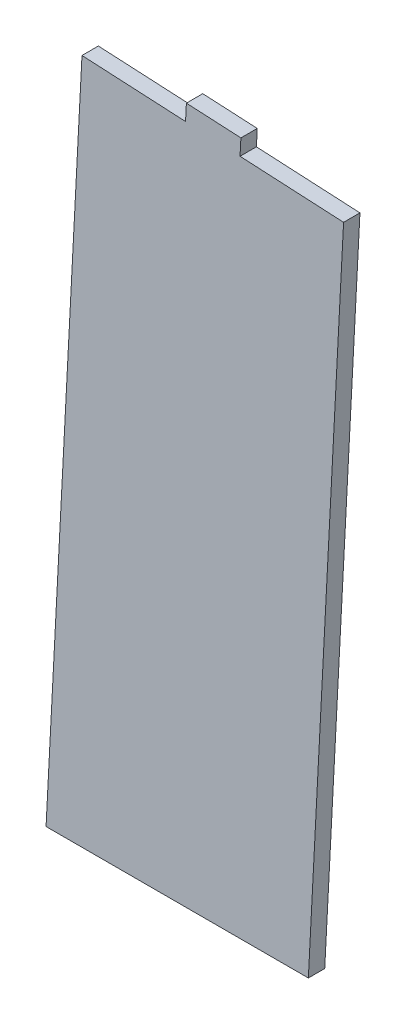
ISO-10303-21;
HEADER;
FILE_DESCRIPTION(('STEP AP214'),'2;1');
FILE_NAME('part.step','',(''),(''),'','','');
FILE_SCHEMA(('AUTOMOTIVE_DESIGN { 1 0 10303 214 1 1 1 1 }'));
ENDSEC;
DATA;
#1=APPLICATION_CONTEXT('core data for automotive mechanical design processes');
#2=APPLICATION_PROTOCOL_DEFINITION('international standard','automotive_design',2000,#1);
#3=PRODUCT_CONTEXT('',#1,'mechanical');
#4=PRODUCT('Part','Part','',(#3));
#5=PRODUCT_RELATED_PRODUCT_CATEGORY('part','',(#4));
#6=PRODUCT_DEFINITION_FORMATION('','',#4);
#7=PRODUCT_DEFINITION_CONTEXT('part definition',#1,'design');
#8=PRODUCT_DEFINITION('design','',#6,#7);
#9=PRODUCT_DEFINITION_SHAPE('','',#8);
#10=(LENGTH_UNIT() NAMED_UNIT(*) SI_UNIT(.MILLI.,.METRE.));
#11=(NAMED_UNIT(*) PLANE_ANGLE_UNIT() SI_UNIT($,.RADIAN.));
#12=(NAMED_UNIT(*) SI_UNIT($,.STERADIAN.) SOLID_ANGLE_UNIT());
#13=UNCERTAINTY_MEASURE_WITH_UNIT(LENGTH_MEASURE(1.E-05),#10,'distance_accuracy_value','');
#14=(GEOMETRIC_REPRESENTATION_CONTEXT(3) GLOBAL_UNCERTAINTY_ASSIGNED_CONTEXT((#13)) GLOBAL_UNIT_ASSIGNED_CONTEXT((#10,
#11,#12)) REPRESENTATION_CONTEXT('',''));
#15=CARTESIAN_POINT('',(0.,0.,0.));
#16=DIRECTION('',(0.,0.,1.));
#17=DIRECTION('',(1.,0.,0.));
#18=AXIS2_PLACEMENT_3D('',#15,#16,#17);
#19=CARTESIAN_POINT('',(4.13878690933079,59.8654361290315,1798.5));
#20=DIRECTION('',(-0.0523359562429365,-0.998629534754574,0.));
#21=DIRECTION('',(0.998629534754574,-0.0523359562429365,0.));
#22=AXIS2_PLACEMENT_3D('',#19,#20,#21);
#23=PLANE('',#22);
#24=DIRECTION('',(0.,0.,-1.));
#25=VECTOR('',#24,1.);
#26=CARTESIAN_POINT('',(18.6189151632721,59.1065647635089,1.5));
#27=LINE('',#26,#25);
#28=CARTESIAN_POINT('',(18.6189151632721,59.1065647635089,1.5));
#29=VERTEX_POINT('',#28);
#30=CARTESIAN_POINT('',(18.6189151632721,59.1065647635089,0.));
#31=VERTEX_POINT('',#30);
#32=EDGE_CURVE('E169',#29,#31,#27,.T.);
#33=ORIENTED_EDGE('',*,*,#32,.F.);
#34=DIRECTION('',(-0.998629534754574,0.0523359562429365,0.));
#35=VECTOR('',#34,1.);
#36=CARTESIAN_POINT('',(3.14015737457621,59.9177720852744,1.50000000000006));
#37=LINE('',#36,#35);
#38=CARTESIAN_POINT('',(28.1058957434406,58.609373179201,1.50000000000006));
#39=VERTEX_POINT('',#38);
#40=EDGE_CURVE('E183',#39,#29,#37,.T.);
#41=ORIENTED_EDGE('',*,*,#40,.F.);
#42=DIRECTION('',(0.,0.,-1.));
#43=VECTOR('',#42,1.);
#44=CARTESIAN_POINT('',(28.1058957434406,58.609373179201,-2.04263689296269E-13));
#45=LINE('',#44,#43);
#46=CARTESIAN_POINT('',(28.1058957434406,58.609373179201,-1.07631097794881E-13));
#47=VERTEX_POINT('',#46);
#48=EDGE_CURVE('E98',#39,#47,#45,.T.);
#49=ORIENTED_EDGE('',*,*,#48,.T.);
#50=DIRECTION('',(-0.998629534754574,0.0523359562429365,0.));
#51=VECTOR('',#50,1.);
#52=CARTESIAN_POINT('',(4.26944748841527,59.8585884982419,0.));
#53=LINE('',#52,#51);
#54=EDGE_CURVE('E189',#47,#31,#53,.T.);
#55=ORIENTED_EDGE('',*,*,#54,.T.);
#56=EDGE_LOOP('',(#33,#41,#49,#55));
#57=FACE_BOUND('',#56,.T.);
#58=ADVANCED_FACE('F42',(#57),#23,.F.);
#59=CARTESIAN_POINT('',(13.6257674894992,59.3682445447236,1.5));
#60=VERTEX_POINT('',#59);
#61=CARTESIAN_POINT('',(4.13878690933078,59.8654361290315,1.50000000000003));
#62=VERTEX_POINT('',#61);
#63=EDGE_CURVE('E188',#60,#62,#37,.T.);
#64=ORIENTED_EDGE('',*,*,#63,.F.);
#65=DIRECTION('',(0.,0.,-1.));
#66=VECTOR('',#65,1.);
#67=CARTESIAN_POINT('',(13.6257674894992,59.3682445447236,1.5));
#68=LINE('',#67,#66);
#69=CARTESIAN_POINT('',(13.6257674894992,59.3682445447236,0.));
#70=VERTEX_POINT('',#69);
#71=EDGE_CURVE('E158',#60,#70,#68,.T.);
#72=ORIENTED_EDGE('',*,*,#71,.T.);
#73=CARTESIAN_POINT('',(4.13878690933079,59.8654361290315,0.));
#74=VERTEX_POINT('',#73);
#75=EDGE_CURVE('E168',#70,#74,#53,.T.);
#76=ORIENTED_EDGE('',*,*,#75,.T.);
#77=DIRECTION('',(0.,0.,-1.));
#78=VECTOR('',#77,1.);
#79=CARTESIAN_POINT('',(4.13878690933078,59.8654361290315,1800.));
#80=LINE('',#79,#78);
#81=EDGE_CURVE('E46',#62,#74,#80,.T.);
#82=ORIENTED_EDGE('',*,*,#81,.F.);
#83=EDGE_LOOP('',(#64,#72,#76,#82));
#84=FACE_BOUND('',#83,.T.);
#85=ADVANCED_FACE('F44',(#84),#23,.F.);
#86=CARTESIAN_POINT('',(0.893128940112842,-4.56540722323783,0.));
#87=DIRECTION('',(0.,0.,-1.));
#88=DIRECTION('',(-1.,0.,0.));
#89=AXIS2_PLACEMENT_3D('',#86,#87,#88);
#90=PLANE('',#89);
#91=ORIENTED_EDGE('',*,*,#54,.F.);
#92=DIRECTION('',(0.0523359562429369,0.998629534754574,0.));
#93=VECTOR('',#92,1.);
#94=CARTESIAN_POINT('',(25.0442423032288,0.189545396058448,-2.15262195589763E-13));
#95=LINE('',#94,#93);
#96=CARTESIAN_POINT('',(24.8788982427083,-2.96540722323783,-2.18193638626963E-13));
#97=VERTEX_POINT('',#96);
#98=EDGE_CURVE('E11',#97,#47,#95,.T.);
#99=ORIENTED_EDGE('',*,*,#98,.F.);
#100=DIRECTION('',(1.,0.,0.));
#101=VECTOR('',#100,1.);
#102=CARTESIAN_POINT('',(24.8788982427083,-2.96540722323783,-2.19659360145563E-13));
#103=LINE('',#102,#101);
#104=CARTESIAN_POINT('',(0.845961938758162,-2.96540722323783,-1.47596055747693E-13));
#105=VERTEX_POINT('',#104);
#106=EDGE_CURVE('E70',#105,#97,#103,.T.);
#107=ORIENTED_EDGE('',*,*,#106,.F.);
#108=DIRECTION('',(-0.0523359562429369,-0.998629534754574,0.));
#109=VECTOR('',#108,1.);
#110=CARTESIAN_POINT('',(4.13878690933079,59.8654361290315,0.));
#111=LINE('',#110,#109);
#112=EDGE_CURVE('E51',#74,#105,#111,.T.);
#113=ORIENTED_EDGE('',*,*,#112,.F.);
#114=ORIENTED_EDGE('',*,*,#75,.F.);
#115=DIRECTION('',(0.052335956242937,0.998629534754574,0.));
#116=VECTOR('',#115,1.);
#117=CARTESIAN_POINT('',(13.6257674894992,59.3682445447236,0.));
#118=LINE('',#117,#116);
#119=CARTESIAN_POINT('',(13.7042714238637,60.8661888468555,0.));
#120=VERTEX_POINT('',#119);
#121=EDGE_CURVE('E61',#70,#120,#118,.T.);
#122=ORIENTED_EDGE('',*,*,#121,.T.);
#123=DIRECTION('',(0.998629534754574,-0.0523359562429368,0.));
#124=VECTOR('',#123,1.);
#125=CARTESIAN_POINT('',(13.7042714238637,60.8661888468555,0.));
#126=LINE('',#125,#124);
#127=CARTESIAN_POINT('',(18.6974190976365,60.6045090656408,0.));
#128=VERTEX_POINT('',#127);
#129=EDGE_CURVE('E143',#120,#128,#126,.T.);
#130=ORIENTED_EDGE('',*,*,#129,.T.);
#131=DIRECTION('',(-0.052335956242937,-0.998629534754574,0.));
#132=VECTOR('',#131,1.);
#133=CARTESIAN_POINT('',(18.6189151632721,59.1065647635089,0.));
#134=LINE('',#133,#132);
#135=EDGE_CURVE('E159',#128,#31,#134,.T.);
#136=ORIENTED_EDGE('',*,*,#135,.T.);
#137=EDGE_LOOP('',(#91,#99,#107,#113,#114,#122,#130,#136));
#138=FACE_BOUND('',#137,.T.);
#139=ADVANCED_FACE('F198',(#138),#90,.T.);
#140=CARTESIAN_POINT('',(25.0442423032288,0.189545396058448,-2.04263689296269E-13));
#141=DIRECTION('',(0.998629534754574,-0.0523359562429369,0.));
#142=DIRECTION('',(0.0523359562429369,0.998629534754574,0.));
#143=AXIS2_PLACEMENT_3D('',#140,#141,#142);
#144=PLANE('',#143);
#145=ORIENTED_EDGE('',*,*,#48,.F.);
#146=DIRECTION('',(0.0523359562429368,0.998629534754574,0.));
#147=VECTOR('',#146,1.);
#148=CARTESIAN_POINT('',(24.8788982427083,-2.96540722323783,1.49999999999978));
#149=LINE('',#148,#147);
#150=CARTESIAN_POINT('',(24.8788982427083,-2.96540722323783,1.49999999999978));
#151=VERTEX_POINT('',#150);
#152=EDGE_CURVE('E178',#151,#39,#149,.T.);
#153=ORIENTED_EDGE('',*,*,#152,.F.);
#154=DIRECTION('',(0.,0.,-1.));
#155=VECTOR('',#154,1.);
#156=CARTESIAN_POINT('',(24.8788982427083,-2.96540722323783,1.49999999999978));
#157=LINE('',#156,#155);
#158=EDGE_CURVE('E173',#97,#151,#157,.F.);
#159=ORIENTED_EDGE('',*,*,#158,.F.);
#160=ORIENTED_EDGE('',*,*,#98,.T.);
#161=EDGE_LOOP('',(#145,#153,#159,#160));
#162=FACE_BOUND('',#161,.T.);
#163=ADVANCED_FACE('F200',(#162),#144,.T.);
#164=CARTESIAN_POINT('',(24.8788982427083,-2.96540722323783,1.49999999999978));
#165=DIRECTION('',(0.,-1.,0.));
#166=DIRECTION('',(0.,0.,-1.));
#167=AXIS2_PLACEMENT_3D('',#164,#165,#166);
#168=PLANE('',#167);
#169=DIRECTION('',(1.,0.,0.));
#170=VECTOR('',#169,1.);
#171=CARTESIAN_POINT('',(0.,-2.96540722323783,1.49999999999978));
#172=LINE('',#171,#170);
#173=CARTESIAN_POINT('',(0.845961938758164,-2.96540722323784,1.49999999999978));
#174=VERTEX_POINT('',#173);
#175=EDGE_CURVE('E179',#174,#151,#172,.T.);
#176=ORIENTED_EDGE('',*,*,#175,.F.);
#177=DIRECTION('',(0.,0.,-1.));
#178=VECTOR('',#177,1.);
#179=CARTESIAN_POINT('',(0.845961938758164,-2.96540722323783,1.49999999999978));
#180=LINE('',#179,#178);
#181=EDGE_CURVE('E88',#174,#105,#180,.T.);
#182=ORIENTED_EDGE('',*,*,#181,.T.);
#183=ORIENTED_EDGE('',*,*,#106,.T.);
#184=ORIENTED_EDGE('',*,*,#158,.T.);
#185=EDGE_LOOP('',(#176,#182,#183,#184));
#186=FACE_BOUND('',#185,.T.);
#187=ADVANCED_FACE('F205',(#186),#168,.T.);
#188=CARTESIAN_POINT('',(0.,0.,1.49999999999979));
#189=DIRECTION('',(0.,0.,1.));
#190=DIRECTION('',(0.,-1.,0.));
#191=AXIS2_PLACEMENT_3D('',#188,#189,#190);
#192=PLANE('',#191);
#193=DIRECTION('',(-0.0523359562429367,-0.998629534754574,0.));
#194=VECTOR('',#193,1.);
#195=CARTESIAN_POINT('',(4.08645095308784,58.8668065942769,1.5));
#196=LINE('',#195,#194);
#197=EDGE_CURVE('E182',#62,#174,#196,.T.);
#198=ORIENTED_EDGE('',*,*,#197,.T.);
#199=ORIENTED_EDGE('',*,*,#175,.T.);
#200=ORIENTED_EDGE('',*,*,#152,.T.);
#201=ORIENTED_EDGE('',*,*,#40,.T.);
#202=DIRECTION('',(-0.052335956242937,-0.998629534754574,0.));
#203=VECTOR('',#202,1.);
#204=CARTESIAN_POINT('',(18.6189151632721,59.1065647635089,1.5));
#205=LINE('',#204,#203);
#206=CARTESIAN_POINT('',(18.6974190976365,60.6045090656408,1.5));
#207=VERTEX_POINT('',#206);
#208=EDGE_CURVE('E146',#207,#29,#205,.T.);
#209=ORIENTED_EDGE('',*,*,#208,.F.);
#210=DIRECTION('',(0.998629534754574,-0.0523359562429368,0.));
#211=VECTOR('',#210,1.);
#212=CARTESIAN_POINT('',(13.7042714238637,60.8661888468555,1.5));
#213=LINE('',#212,#211);
#214=CARTESIAN_POINT('',(13.7042714238637,60.8661888468555,1.5));
#215=VERTEX_POINT('',#214);
#216=EDGE_CURVE('E141',#215,#207,#213,.T.);
#217=ORIENTED_EDGE('',*,*,#216,.F.);
#218=DIRECTION('',(0.052335956242937,0.998629534754574,0.));
#219=VECTOR('',#218,1.);
#220=CARTESIAN_POINT('',(13.6257674894992,59.3682445447236,1.5));
#221=LINE('',#220,#219);
#222=EDGE_CURVE('E153',#60,#215,#221,.T.);
#223=ORIENTED_EDGE('',*,*,#222,.F.);
#224=ORIENTED_EDGE('',*,*,#63,.T.);
#225=EDGE_LOOP('',(#198,#199,#200,#201,#209,#217,#223,#224));
#226=FACE_BOUND('',#225,.T.);
#227=ADVANCED_FACE('F152',(#226),#192,.T.);
#228=CARTESIAN_POINT('',(4.08645095308785,58.8668065942769,2.5));
#229=DIRECTION('',(-0.998629534754574,0.0523359562429353,0.));
#230=DIRECTION('',(-0.0523359562429353,-0.998629534754574,0.));
#231=AXIS2_PLACEMENT_3D('',#228,#229,#230);
#232=PLANE('',#231);
#233=ORIENTED_EDGE('',*,*,#81,.T.);
#234=ORIENTED_EDGE('',*,*,#112,.T.);
#235=ORIENTED_EDGE('',*,*,#181,.F.);
#236=ORIENTED_EDGE('',*,*,#197,.F.);
#237=EDGE_LOOP('',(#233,#234,#235,#236));
#238=FACE_BOUND('',#237,.T.);
#239=ADVANCED_FACE('F197',(#238),#232,.T.);
#240=CARTESIAN_POINT('',(13.6257674894992,59.3682445447236,1.5));
#241=DIRECTION('',(-0.998629534754574,0.052335956242937,0.));
#242=DIRECTION('',(-0.052335956242937,-0.998629534754574,0.));
#243=AXIS2_PLACEMENT_3D('',#240,#241,#242);
#244=PLANE('',#243);
#245=ORIENTED_EDGE('',*,*,#121,.F.);
#246=ORIENTED_EDGE('',*,*,#71,.F.);
#247=ORIENTED_EDGE('',*,*,#222,.T.);
#248=DIRECTION('',(0.,0.,-1.));
#249=VECTOR('',#248,1.);
#250=CARTESIAN_POINT('',(13.7042714238637,60.8661888468555,1.5));
#251=LINE('',#250,#249);
#252=EDGE_CURVE('E138',#215,#120,#251,.T.);
#253=ORIENTED_EDGE('',*,*,#252,.T.);
#254=EDGE_LOOP('',(#245,#246,#247,#253));
#255=FACE_BOUND('',#254,.T.);
#256=ADVANCED_FACE('F157',(#255),#244,.T.);
#257=CARTESIAN_POINT('',(18.6189151632721,59.1065647635089,1.5));
#258=DIRECTION('',(0.998629534754574,-0.052335956242937,0.));
#259=DIRECTION('',(0.052335956242937,0.998629534754574,0.));
#260=AXIS2_PLACEMENT_3D('',#257,#258,#259);
#261=PLANE('',#260);
#262=ORIENTED_EDGE('',*,*,#135,.F.);
#263=DIRECTION('',(0.,0.,-1.));
#264=VECTOR('',#263,1.);
#265=CARTESIAN_POINT('',(18.6974190976365,60.6045090656408,1.5));
#266=LINE('',#265,#264);
#267=EDGE_CURVE('E145',#207,#128,#266,.T.);
#268=ORIENTED_EDGE('',*,*,#267,.F.);
#269=ORIENTED_EDGE('',*,*,#208,.T.);
#270=ORIENTED_EDGE('',*,*,#32,.T.);
#271=EDGE_LOOP('',(#262,#268,#269,#270));
#272=FACE_BOUND('',#271,.T.);
#273=ADVANCED_FACE('F208',(#272),#261,.T.);
#274=CARTESIAN_POINT('',(13.7042714238637,60.8661888468555,1.5));
#275=DIRECTION('',(0.0523359562429368,0.998629534754574,0.));
#276=DIRECTION('',(-0.998629534754574,0.0523359562429368,0.));
#277=AXIS2_PLACEMENT_3D('',#274,#275,#276);
#278=PLANE('',#277);
#279=ORIENTED_EDGE('',*,*,#129,.F.);
#280=ORIENTED_EDGE('',*,*,#252,.F.);
#281=ORIENTED_EDGE('',*,*,#216,.T.);
#282=ORIENTED_EDGE('',*,*,#267,.T.);
#283=EDGE_LOOP('',(#279,#280,#281,#282));
#284=FACE_BOUND('',#283,.T.);
#285=ADVANCED_FACE('F140',(#284),#278,.T.);
#286=CLOSED_SHELL('',(#58,#85,#139,#163,#187,#227,#239,#256,#273,#285));
#287=MANIFOLD_SOLID_BREP('B2',#286);
#288=ADVANCED_BREP_SHAPE_REPRESENTATION('',(#18,#287),#14);
#289=SHAPE_DEFINITION_REPRESENTATION(#9,#288);
ENDSEC;
END-ISO-10303-21;
